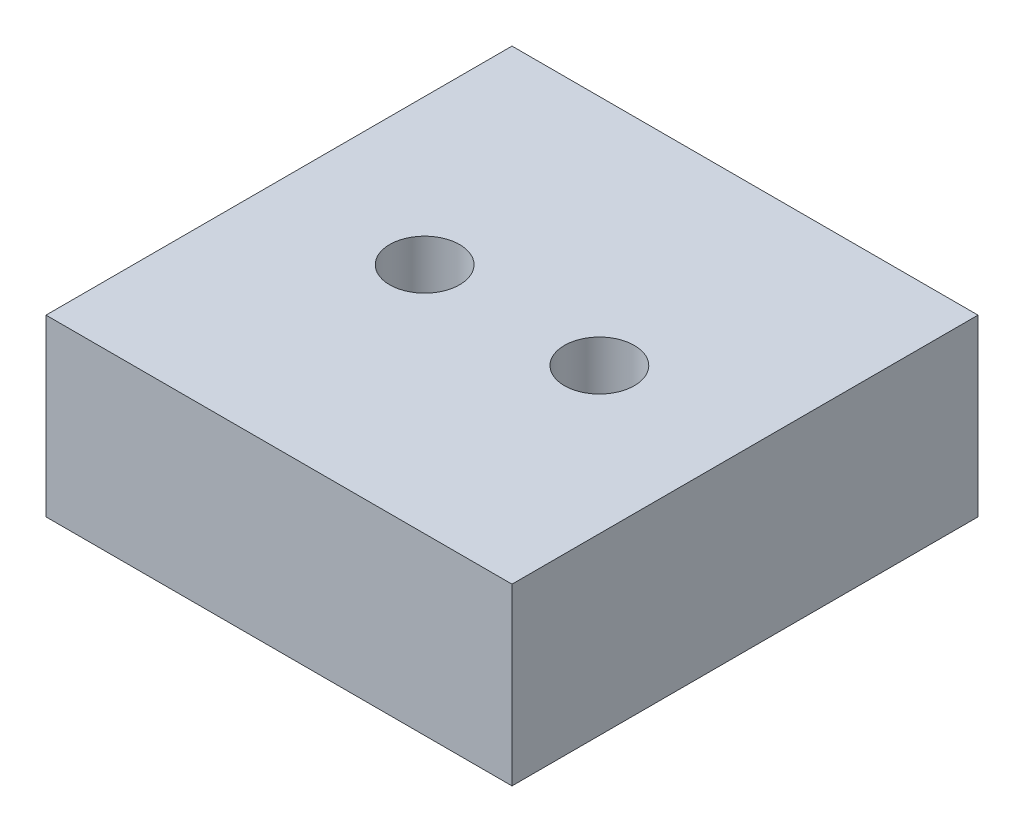
ISO-10303-21;
HEADER;
FILE_DESCRIPTION(('STEP AP214'),'2;1');
FILE_NAME('part.step','',(''),(''),'','','');
FILE_SCHEMA(('AUTOMOTIVE_DESIGN { 1 0 10303 214 1 1 1 1 }'));
ENDSEC;
DATA;
#1=APPLICATION_CONTEXT('core data for automotive mechanical design processes');
#2=APPLICATION_PROTOCOL_DEFINITION('international standard','automotive_design',2000,#1);
#3=PRODUCT_CONTEXT('',#1,'mechanical');
#4=PRODUCT('Part','Part','',(#3));
#5=PRODUCT_RELATED_PRODUCT_CATEGORY('part','',(#4));
#6=PRODUCT_DEFINITION_FORMATION('','',#4);
#7=PRODUCT_DEFINITION_CONTEXT('part definition',#1,'design');
#8=PRODUCT_DEFINITION('design','',#6,#7);
#9=PRODUCT_DEFINITION_SHAPE('','',#8);
#10=(LENGTH_UNIT() NAMED_UNIT(*) SI_UNIT(.MILLI.,.METRE.));
#11=(NAMED_UNIT(*) PLANE_ANGLE_UNIT() SI_UNIT($,.RADIAN.));
#12=(NAMED_UNIT(*) SI_UNIT($,.STERADIAN.) SOLID_ANGLE_UNIT());
#13=UNCERTAINTY_MEASURE_WITH_UNIT(LENGTH_MEASURE(1.E-05),#10,'distance_accuracy_value','');
#14=(GEOMETRIC_REPRESENTATION_CONTEXT(3) GLOBAL_UNCERTAINTY_ASSIGNED_CONTEXT((#13)) GLOBAL_UNIT_ASSIGNED_CONTEXT((#10,
#11,#12)) REPRESENTATION_CONTEXT('',''));
#15=CARTESIAN_POINT('',(0.,0.,0.));
#16=DIRECTION('',(0.,0.,1.));
#17=DIRECTION('',(1.,0.,0.));
#18=AXIS2_PLACEMENT_3D('',#15,#16,#17);
#19=CARTESIAN_POINT('',(0.,15.,0.));
#20=DIRECTION('',(0.,1.,0.));
#21=DIRECTION('',(0.,0.,1.));
#22=AXIS2_PLACEMENT_3D('',#19,#20,#21);
#23=PLANE('',#22);
#24=CARTESIAN_POINT('',(-7.5,15.,0.));
#25=DIRECTION('',(0.,1.,0.));
#26=DIRECTION('',(0.,0.,1.));
#27=AXIS2_PLACEMENT_3D('',#24,#25,#26);
#28=CIRCLE('',#27,3.);
#29=CARTESIAN_POINT('',(-7.5,15.,3.));
#30=VERTEX_POINT('',#29);
#31=EDGE_CURVE('E100',#30,#30,#28,.T.);
#32=ORIENTED_EDGE('',*,*,#31,.F.);
#33=EDGE_LOOP('',(#32));
#34=FACE_BOUND('',#33,.T.);
#35=DIRECTION('',(0.,0.,1.));
#36=VECTOR('',#35,1.);
#37=CARTESIAN_POINT('',(-20.,15.,-20.));
#38=LINE('',#37,#36);
#39=CARTESIAN_POINT('',(-20.,15.,-20.));
#40=VERTEX_POINT('',#39);
#41=CARTESIAN_POINT('',(-20.,15.,20.));
#42=VERTEX_POINT('',#41);
#43=EDGE_CURVE('E85',#40,#42,#38,.T.);
#44=ORIENTED_EDGE('',*,*,#43,.T.);
#45=DIRECTION('',(1.,0.,0.));
#46=VECTOR('',#45,1.);
#47=CARTESIAN_POINT('',(-20.,15.,20.));
#48=LINE('',#47,#46);
#49=CARTESIAN_POINT('',(20.,15.,20.));
#50=VERTEX_POINT('',#49);
#51=EDGE_CURVE('E80',#42,#50,#48,.T.);
#52=ORIENTED_EDGE('',*,*,#51,.T.);
#53=DIRECTION('',(0.,0.,-1.));
#54=VECTOR('',#53,1.);
#55=CARTESIAN_POINT('',(20.,15.,-20.));
#56=LINE('',#55,#54);
#57=CARTESIAN_POINT('',(20.,15.,-20.));
#58=VERTEX_POINT('',#57);
#59=EDGE_CURVE('E83',#50,#58,#56,.T.);
#60=ORIENTED_EDGE('',*,*,#59,.T.);
#61=DIRECTION('',(-1.,0.,0.));
#62=VECTOR('',#61,1.);
#63=CARTESIAN_POINT('',(-20.,15.,-20.));
#64=LINE('',#63,#62);
#65=EDGE_CURVE('E50',#58,#40,#64,.T.);
#66=ORIENTED_EDGE('',*,*,#65,.T.);
#67=EDGE_LOOP('',(#44,#52,#60,#66));
#68=FACE_BOUND('',#67,.T.);
#69=CARTESIAN_POINT('',(7.5,15.,0.));
#70=DIRECTION('',(0.,1.,0.));
#71=DIRECTION('',(0.,0.,1.));
#72=AXIS2_PLACEMENT_3D('',#69,#70,#71);
#73=CIRCLE('',#72,3.);
#74=CARTESIAN_POINT('',(7.5,15.,3.));
#75=VERTEX_POINT('',#74);
#76=EDGE_CURVE('E115',#75,#75,#73,.T.);
#77=ORIENTED_EDGE('',*,*,#76,.F.);
#78=EDGE_LOOP('',(#77));
#79=FACE_BOUND('',#78,.T.);
#80=ADVANCED_FACE('F33',(#34,#68,#79),#23,.T.);
#81=CARTESIAN_POINT('',(0.,0.,0.));
#82=DIRECTION('',(0.,1.,0.));
#83=DIRECTION('',(0.,0.,1.));
#84=AXIS2_PLACEMENT_3D('',#81,#82,#83);
#85=PLANE('',#84);
#86=DIRECTION('',(0.,0.,1.));
#87=VECTOR('',#86,1.);
#88=CARTESIAN_POINT('',(-20.,0.,-20.));
#89=LINE('',#88,#87);
#90=CARTESIAN_POINT('',(-20.,0.,-20.));
#91=VERTEX_POINT('',#90);
#92=CARTESIAN_POINT('',(-20.,0.,20.));
#93=VERTEX_POINT('',#92);
#94=EDGE_CURVE('E97',#91,#93,#89,.T.);
#95=ORIENTED_EDGE('',*,*,#94,.F.);
#96=DIRECTION('',(-1.,0.,0.));
#97=VECTOR('',#96,1.);
#98=CARTESIAN_POINT('',(-20.,0.,-20.));
#99=LINE('',#98,#97);
#100=CARTESIAN_POINT('',(20.,0.,-20.));
#101=VERTEX_POINT('',#100);
#102=EDGE_CURVE('E73',#101,#91,#99,.T.);
#103=ORIENTED_EDGE('',*,*,#102,.F.);
#104=DIRECTION('',(0.,0.,-1.));
#105=VECTOR('',#104,1.);
#106=CARTESIAN_POINT('',(20.,0.,-20.));
#107=LINE('',#106,#105);
#108=CARTESIAN_POINT('',(20.,0.,20.));
#109=VERTEX_POINT('',#108);
#110=EDGE_CURVE('E67',#109,#101,#107,.T.);
#111=ORIENTED_EDGE('',*,*,#110,.F.);
#112=DIRECTION('',(1.,0.,0.));
#113=VECTOR('',#112,1.);
#114=CARTESIAN_POINT('',(-20.,0.,20.));
#115=LINE('',#114,#113);
#116=EDGE_CURVE('E89',#93,#109,#115,.T.);
#117=ORIENTED_EDGE('',*,*,#116,.F.);
#118=EDGE_LOOP('',(#95,#103,#111,#117));
#119=FACE_BOUND('',#118,.T.);
#120=CARTESIAN_POINT('',(-7.5,0.,0.));
#121=DIRECTION('',(0.,1.,0.));
#122=DIRECTION('',(0.,0.,1.));
#123=AXIS2_PLACEMENT_3D('',#120,#121,#122);
#124=CIRCLE('',#123,3.);
#125=CARTESIAN_POINT('',(-7.5,0.,3.));
#126=VERTEX_POINT('',#125);
#127=EDGE_CURVE('E112',#126,#126,#124,.T.);
#128=ORIENTED_EDGE('',*,*,#127,.T.);
#129=EDGE_LOOP('',(#128));
#130=FACE_BOUND('',#129,.T.);
#131=CARTESIAN_POINT('',(7.5,0.,0.));
#132=DIRECTION('',(0.,1.,0.));
#133=DIRECTION('',(0.,0.,1.));
#134=AXIS2_PLACEMENT_3D('',#131,#132,#133);
#135=CIRCLE('',#134,3.);
#136=CARTESIAN_POINT('',(7.5,0.,3.));
#137=VERTEX_POINT('',#136);
#138=EDGE_CURVE('E118',#137,#137,#135,.T.);
#139=ORIENTED_EDGE('',*,*,#138,.T.);
#140=EDGE_LOOP('',(#139));
#141=FACE_BOUND('',#140,.T.);
#142=ADVANCED_FACE('F108',(#119,#130,#141),#85,.F.);
#143=CARTESIAN_POINT('',(-20.,15.,-20.));
#144=DIRECTION('',(1.,0.,0.));
#145=DIRECTION('',(0.,0.,-1.));
#146=AXIS2_PLACEMENT_3D('',#143,#144,#145);
#147=PLANE('',#146);
#148=ORIENTED_EDGE('',*,*,#94,.T.);
#149=DIRECTION('',(0.,-1.,0.));
#150=VECTOR('',#149,1.);
#151=CARTESIAN_POINT('',(-20.,15.,20.));
#152=LINE('',#151,#150);
#153=EDGE_CURVE('E11',#42,#93,#152,.T.);
#154=ORIENTED_EDGE('',*,*,#153,.F.);
#155=ORIENTED_EDGE('',*,*,#43,.F.);
#156=DIRECTION('',(0.,-1.,0.));
#157=VECTOR('',#156,1.);
#158=CARTESIAN_POINT('',(-20.,15.,-20.));
#159=LINE('',#158,#157);
#160=EDGE_CURVE('E93',#40,#91,#159,.T.);
#161=ORIENTED_EDGE('',*,*,#160,.T.);
#162=EDGE_LOOP('',(#148,#154,#155,#161));
#163=FACE_BOUND('',#162,.T.);
#164=ADVANCED_FACE('F35',(#163),#147,.F.);
#165=CARTESIAN_POINT('',(-20.,15.,20.));
#166=DIRECTION('',(0.,0.,-1.));
#167=DIRECTION('',(-1.,0.,0.));
#168=AXIS2_PLACEMENT_3D('',#165,#166,#167);
#169=PLANE('',#168);
#170=ORIENTED_EDGE('',*,*,#116,.T.);
#171=DIRECTION('',(0.,-1.,0.));
#172=VECTOR('',#171,1.);
#173=CARTESIAN_POINT('',(20.,15.,20.));
#174=LINE('',#173,#172);
#175=EDGE_CURVE('E42',#50,#109,#174,.T.);
#176=ORIENTED_EDGE('',*,*,#175,.F.);
#177=ORIENTED_EDGE('',*,*,#51,.F.);
#178=ORIENTED_EDGE('',*,*,#153,.T.);
#179=EDGE_LOOP('',(#170,#176,#177,#178));
#180=FACE_BOUND('',#179,.T.);
#181=ADVANCED_FACE('F88',(#180),#169,.F.);
#182=CARTESIAN_POINT('',(20.,15.,-20.));
#183=DIRECTION('',(-1.,0.,0.));
#184=DIRECTION('',(0.,0.,1.));
#185=AXIS2_PLACEMENT_3D('',#182,#183,#184);
#186=PLANE('',#185);
#187=ORIENTED_EDGE('',*,*,#110,.T.);
#188=DIRECTION('',(0.,-1.,0.));
#189=VECTOR('',#188,1.);
#190=CARTESIAN_POINT('',(20.,15.,-20.));
#191=LINE('',#190,#189);
#192=EDGE_CURVE('E90',#58,#101,#191,.T.);
#193=ORIENTED_EDGE('',*,*,#192,.F.);
#194=ORIENTED_EDGE('',*,*,#59,.F.);
#195=ORIENTED_EDGE('',*,*,#175,.T.);
#196=EDGE_LOOP('',(#187,#193,#194,#195));
#197=FACE_BOUND('',#196,.T.);
#198=ADVANCED_FACE('F91',(#197),#186,.F.);
#199=CARTESIAN_POINT('',(-20.,15.,-20.));
#200=DIRECTION('',(0.,0.,1.));
#201=DIRECTION('',(1.,0.,0.));
#202=AXIS2_PLACEMENT_3D('',#199,#200,#201);
#203=PLANE('',#202);
#204=ORIENTED_EDGE('',*,*,#102,.T.);
#205=ORIENTED_EDGE('',*,*,#160,.F.);
#206=ORIENTED_EDGE('',*,*,#65,.F.);
#207=ORIENTED_EDGE('',*,*,#192,.T.);
#208=EDGE_LOOP('',(#204,#205,#206,#207));
#209=FACE_BOUND('',#208,.T.);
#210=ADVANCED_FACE('F105',(#209),#203,.F.);
#211=CARTESIAN_POINT('',(-7.5,15.,0.));
#212=DIRECTION('',(0.,-1.,0.));
#213=DIRECTION('',(0.,0.,-1.));
#214=AXIS2_PLACEMENT_3D('',#211,#212,#213);
#215=CYLINDRICAL_SURFACE('',#214,3.);
#216=ORIENTED_EDGE('',*,*,#31,.T.);
#217=EDGE_LOOP('',(#216));
#218=FACE_BOUND('',#217,.T.);
#219=ORIENTED_EDGE('',*,*,#127,.F.);
#220=EDGE_LOOP('',(#219));
#221=FACE_BOUND('',#220,.T.);
#222=ADVANCED_FACE('F135',(#218,#221),#215,.F.);
#223=CARTESIAN_POINT('',(7.5,15.,0.));
#224=DIRECTION('',(0.,-1.,0.));
#225=DIRECTION('',(0.,0.,-1.));
#226=AXIS2_PLACEMENT_3D('',#223,#224,#225);
#227=CYLINDRICAL_SURFACE('',#226,3.);
#228=ORIENTED_EDGE('',*,*,#76,.T.);
#229=EDGE_LOOP('',(#228));
#230=FACE_BOUND('',#229,.T.);
#231=ORIENTED_EDGE('',*,*,#138,.F.);
#232=EDGE_LOOP('',(#231));
#233=FACE_BOUND('',#232,.T.);
#234=ADVANCED_FACE('F124',(#230,#233),#227,.F.);
#235=CLOSED_SHELL('',(#80,#142,#164,#181,#198,#210,#222,#234));
#236=MANIFOLD_SOLID_BREP('B2',#235);
#237=ADVANCED_BREP_SHAPE_REPRESENTATION('',(#18,#236),#14);
#238=SHAPE_DEFINITION_REPRESENTATION(#9,#237);
ENDSEC;
END-ISO-10303-21;
